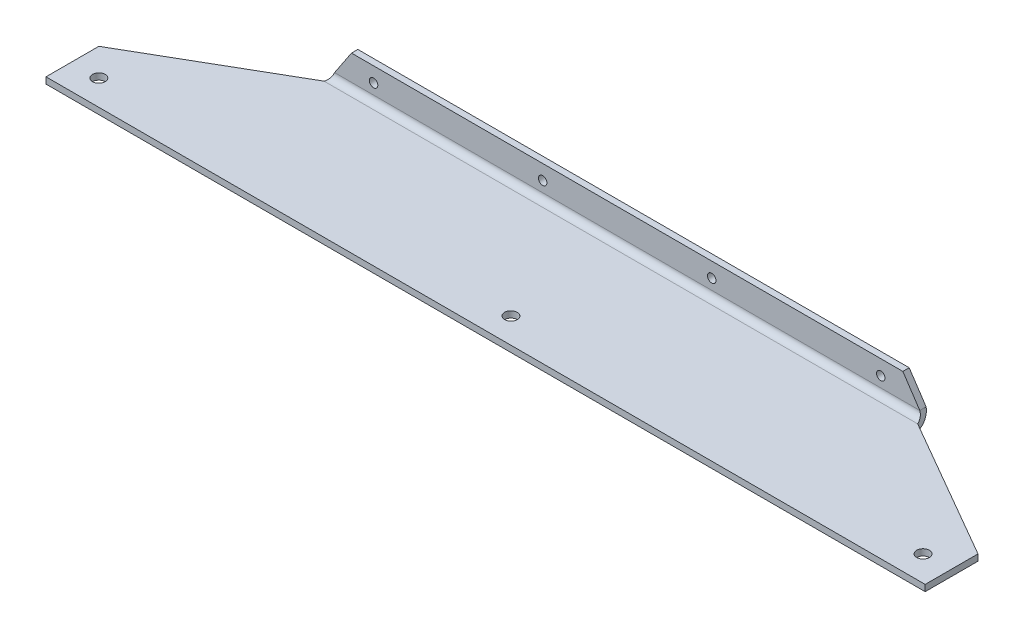
ISO-10303-21;
HEADER;
FILE_DESCRIPTION(('STEP AP214'),'2;1');
FILE_NAME('part.step','',(''),(''),'','','');
FILE_SCHEMA(('AUTOMOTIVE_DESIGN { 1 0 10303 214 1 1 1 1 }'));
ENDSEC;
DATA;
#1=APPLICATION_CONTEXT('core data for automotive mechanical design processes');
#2=APPLICATION_PROTOCOL_DEFINITION('international standard','automotive_design',2000,#1);
#3=PRODUCT_CONTEXT('',#1,'mechanical');
#4=PRODUCT('Part','Part','',(#3));
#5=PRODUCT_RELATED_PRODUCT_CATEGORY('part','',(#4));
#6=PRODUCT_DEFINITION_FORMATION('','',#4);
#7=PRODUCT_DEFINITION_CONTEXT('part definition',#1,'design');
#8=PRODUCT_DEFINITION('design','',#6,#7);
#9=PRODUCT_DEFINITION_SHAPE('','',#8);
#10=(LENGTH_UNIT() NAMED_UNIT(*) SI_UNIT(.MILLI.,.METRE.));
#11=(NAMED_UNIT(*) PLANE_ANGLE_UNIT() SI_UNIT($,.RADIAN.));
#12=(NAMED_UNIT(*) SI_UNIT($,.STERADIAN.) SOLID_ANGLE_UNIT());
#13=UNCERTAINTY_MEASURE_WITH_UNIT(LENGTH_MEASURE(1.E-05),#10,'distance_accuracy_value','');
#14=(GEOMETRIC_REPRESENTATION_CONTEXT(3) GLOBAL_UNCERTAINTY_ASSIGNED_CONTEXT((#13)) GLOBAL_UNIT_ASSIGNED_CONTEXT((#10,
#11,#12)) REPRESENTATION_CONTEXT('',''));
#15=CARTESIAN_POINT('',(0.,0.,0.));
#16=DIRECTION('',(0.,0.,1.));
#17=DIRECTION('',(1.,0.,0.));
#18=AXIS2_PLACEMENT_3D('',#15,#16,#17);
#19=CARTESIAN_POINT('',(208.,-3.,7.00000000000001));
#20=DIRECTION('',(1.,0.,0.));
#21=DIRECTION('',(0.,0.,-1.));
#22=AXIS2_PLACEMENT_3D('',#19,#20,#21);
#23=PLANE('',#22);
#24=DIRECTION('',(0.,0.,-1.));
#25=VECTOR('',#24,1.);
#26=CARTESIAN_POINT('',(208.,0.,7.00000000000001));
#27=LINE('',#26,#25);
#28=CARTESIAN_POINT('',(208.,0.,32.));
#29=VERTEX_POINT('',#28);
#30=CARTESIAN_POINT('',(208.,0.,7.00000000000001));
#31=VERTEX_POINT('',#30);
#32=EDGE_CURVE('E153',#29,#31,#27,.T.);
#33=ORIENTED_EDGE('',*,*,#32,.F.);
#34=DIRECTION('',(0.,1.,0.));
#35=VECTOR('',#34,1.);
#36=CARTESIAN_POINT('',(208.,-3.,32.));
#37=LINE('',#36,#35);
#38=CARTESIAN_POINT('',(208.,-3.,32.));
#39=VERTEX_POINT('',#38);
#40=EDGE_CURVE('E13',#39,#29,#37,.T.);
#41=ORIENTED_EDGE('',*,*,#40,.F.);
#42=DIRECTION('',(0.,0.,-1.));
#43=VECTOR('',#42,1.);
#44=CARTESIAN_POINT('',(208.,-3.,7.00000000000001));
#45=LINE('',#44,#43);
#46=CARTESIAN_POINT('',(208.,-3.,7.00000000000001));
#47=VERTEX_POINT('',#46);
#48=EDGE_CURVE('E168',#39,#47,#45,.T.);
#49=ORIENTED_EDGE('',*,*,#48,.T.);
#50=DIRECTION('',(0.,1.,0.));
#51=VECTOR('',#50,1.);
#52=CARTESIAN_POINT('',(208.,-3.,7.00000000000001));
#53=LINE('',#52,#51);
#54=EDGE_CURVE('E70',#47,#31,#53,.T.);
#55=ORIENTED_EDGE('',*,*,#54,.T.);
#56=EDGE_LOOP('',(#33,#41,#49,#55));
#57=FACE_BOUND('',#56,.T.);
#58=ADVANCED_FACE('F67',(#57),#23,.T.);
#59=CARTESIAN_POINT('',(-208.,-3.,32.));
#60=DIRECTION('',(0.,0.,1.));
#61=DIRECTION('',(1.,0.,0.));
#62=AXIS2_PLACEMENT_3D('',#59,#60,#61);
#63=PLANE('',#62);
#64=DIRECTION('',(1.,0.,0.));
#65=VECTOR('',#64,1.);
#66=CARTESIAN_POINT('',(-208.,0.,32.));
#67=LINE('',#66,#65);
#68=CARTESIAN_POINT('',(-208.,0.,32.));
#69=VERTEX_POINT('',#68);
#70=EDGE_CURVE('E166',#69,#29,#67,.T.);
#71=ORIENTED_EDGE('',*,*,#70,.F.);
#72=DIRECTION('',(0.,1.,0.));
#73=VECTOR('',#72,1.);
#74=CARTESIAN_POINT('',(-208.,-3.,32.));
#75=LINE('',#74,#73);
#76=CARTESIAN_POINT('',(-208.,-3.,32.));
#77=VERTEX_POINT('',#76);
#78=EDGE_CURVE('E76',#77,#69,#75,.T.);
#79=ORIENTED_EDGE('',*,*,#78,.F.);
#80=DIRECTION('',(1.,0.,0.));
#81=VECTOR('',#80,1.);
#82=CARTESIAN_POINT('',(-208.,-3.,32.));
#83=LINE('',#82,#81);
#84=EDGE_CURVE('E141',#77,#39,#83,.T.);
#85=ORIENTED_EDGE('',*,*,#84,.T.);
#86=ORIENTED_EDGE('',*,*,#40,.T.);
#87=EDGE_LOOP('',(#71,#79,#85,#86));
#88=FACE_BOUND('',#87,.T.);
#89=ADVANCED_FACE('F177',(#88),#63,.T.);
#90=CARTESIAN_POINT('',(-208.,-3.,7.));
#91=DIRECTION('',(-1.,0.,0.));
#92=DIRECTION('',(0.,0.,1.));
#93=AXIS2_PLACEMENT_3D('',#90,#91,#92);
#94=PLANE('',#93);
#95=DIRECTION('',(0.,0.,1.));
#96=VECTOR('',#95,1.);
#97=CARTESIAN_POINT('',(-208.,0.,7.));
#98=LINE('',#97,#96);
#99=CARTESIAN_POINT('',(-208.,0.,7.));
#100=VERTEX_POINT('',#99);
#101=EDGE_CURVE('E130',#100,#69,#98,.T.);
#102=ORIENTED_EDGE('',*,*,#101,.F.);
#103=DIRECTION('',(0.,1.,0.));
#104=VECTOR('',#103,1.);
#105=CARTESIAN_POINT('',(-208.,-3.,7.));
#106=LINE('',#105,#104);
#107=CARTESIAN_POINT('',(-208.,-3.,7.));
#108=VERTEX_POINT('',#107);
#109=EDGE_CURVE('E125',#108,#100,#106,.T.);
#110=ORIENTED_EDGE('',*,*,#109,.F.);
#111=DIRECTION('',(0.,0.,1.));
#112=VECTOR('',#111,1.);
#113=CARTESIAN_POINT('',(-208.,-3.,7.));
#114=LINE('',#113,#112);
#115=EDGE_CURVE('E128',#108,#77,#114,.T.);
#116=ORIENTED_EDGE('',*,*,#115,.T.);
#117=ORIENTED_EDGE('',*,*,#78,.T.);
#118=EDGE_LOOP('',(#102,#110,#116,#117));
#119=FACE_BOUND('',#118,.T.);
#120=ADVANCED_FACE('F127',(#119),#94,.T.);
#121=CARTESIAN_POINT('',(-208.,-3.,7.));
#122=DIRECTION('',(-0.500000000000004,0.,-0.866025403784436));
#123=DIRECTION('',(-0.866025403784436,0.,0.500000000000004));
#124=AXIS2_PLACEMENT_3D('',#121,#122,#123);
#125=PLANE('',#124);
#126=DIRECTION('',(-0.866025403784436,0.,0.500000000000004));
#127=VECTOR('',#126,1.);
#128=CARTESIAN_POINT('',(-208.,0.,7.));
#129=LINE('',#128,#127);
#130=CARTESIAN_POINT('',(-140.450018504815,0.,-32.));
#131=VERTEX_POINT('',#130);
#132=EDGE_CURVE('E163',#131,#100,#129,.T.);
#133=ORIENTED_EDGE('',*,*,#132,.F.);
#134=DIRECTION('',(0.,1.,0.));
#135=VECTOR('',#134,1.);
#136=CARTESIAN_POINT('',(-140.450018504815,-3.,-32.));
#137=LINE('',#136,#135);
#138=CARTESIAN_POINT('',(-140.450018504815,-3.00000000000003,-32.));
#139=VERTEX_POINT('',#138);
#140=EDGE_CURVE('E134',#139,#131,#137,.T.);
#141=ORIENTED_EDGE('',*,*,#140,.F.);
#142=DIRECTION('',(-0.866025403784436,0.,0.500000000000004));
#143=VECTOR('',#142,1.);
#144=CARTESIAN_POINT('',(-208.,-3.,7.));
#145=LINE('',#144,#143);
#146=EDGE_CURVE('E139',#139,#108,#145,.T.);
#147=ORIENTED_EDGE('',*,*,#146,.T.);
#148=ORIENTED_EDGE('',*,*,#109,.T.);
#149=EDGE_LOOP('',(#133,#141,#147,#148));
#150=FACE_BOUND('',#149,.T.);
#151=ADVANCED_FACE('F143',(#150),#125,.T.);
#152=CARTESIAN_POINT('',(140.450018504813,-3.,-32.));
#153=DIRECTION('',(0.499999999999998,0.,-0.86602540378444));
#154=DIRECTION('',(-0.86602540378444,0.,-0.499999999999998));
#155=AXIS2_PLACEMENT_3D('',#152,#153,#154);
#156=PLANE('',#155);
#157=DIRECTION('',(-0.86602540378444,0.,-0.499999999999998));
#158=VECTOR('',#157,1.);
#159=CARTESIAN_POINT('',(140.450018504813,0.,-32.));
#160=LINE('',#159,#158);
#161=CARTESIAN_POINT('',(140.450018504813,0.,-32.));
#162=VERTEX_POINT('',#161);
#163=EDGE_CURVE('E156',#31,#162,#160,.T.);
#164=ORIENTED_EDGE('',*,*,#163,.F.);
#165=ORIENTED_EDGE('',*,*,#54,.F.);
#166=DIRECTION('',(-0.86602540378444,0.,-0.499999999999998));
#167=VECTOR('',#166,1.);
#168=CARTESIAN_POINT('',(140.450018504813,-3.,-32.));
#169=LINE('',#168,#167);
#170=CARTESIAN_POINT('',(140.450018504813,-3.,-32.));
#171=VERTEX_POINT('',#170);
#172=EDGE_CURVE('E148',#47,#171,#169,.T.);
#173=ORIENTED_EDGE('',*,*,#172,.T.);
#174=DIRECTION('',(0.,1.,0.));
#175=VECTOR('',#174,1.);
#176=CARTESIAN_POINT('',(140.450018504813,-3.,-32.));
#177=LINE('',#176,#175);
#178=EDGE_CURVE('E171',#171,#162,#177,.T.);
#179=ORIENTED_EDGE('',*,*,#178,.T.);
#180=EDGE_LOOP('',(#164,#165,#173,#179));
#181=FACE_BOUND('',#180,.T.);
#182=ADVANCED_FACE('F173',(#181),#156,.T.);
#183=CARTESIAN_POINT('',(0.,-3.,0.));
#184=DIRECTION('',(0.,1.,0.));
#185=DIRECTION('',(0.,0.,1.));
#186=AXIS2_PLACEMENT_3D('',#183,#184,#185);
#187=PLANE('',#186);
#188=CARTESIAN_POINT('',(0.,-3.,20.));
#189=DIRECTION('',(0.,1.,0.));
#190=DIRECTION('',(0.,0.,1.));
#191=AXIS2_PLACEMENT_3D('',#188,#189,#190);
#192=CIRCLE('',#191,3.);
#193=CARTESIAN_POINT('',(0.,-3.,23.));
#194=VERTEX_POINT('',#193);
#195=EDGE_CURVE('E255',#194,#194,#192,.T.);
#196=ORIENTED_EDGE('',*,*,#195,.T.);
#197=EDGE_LOOP('',(#196));
#198=FACE_BOUND('',#197,.T.);
#199=CARTESIAN_POINT('',(195.,-3.,20.));
#200=DIRECTION('',(0.,1.,0.));
#201=DIRECTION('',(0.,0.,1.));
#202=AXIS2_PLACEMENT_3D('',#199,#200,#201);
#203=CIRCLE('',#202,2.99999999999999);
#204=CARTESIAN_POINT('',(195.,-3.,23.));
#205=VERTEX_POINT('',#204);
#206=EDGE_CURVE('E382',#205,#205,#203,.T.);
#207=ORIENTED_EDGE('',*,*,#206,.T.);
#208=EDGE_LOOP('',(#207));
#209=FACE_BOUND('',#208,.T.);
#210=CARTESIAN_POINT('',(-195.,-3.,20.));
#211=DIRECTION('',(0.,1.,0.));
#212=DIRECTION('',(0.,0.,1.));
#213=AXIS2_PLACEMENT_3D('',#210,#211,#212);
#214=CIRCLE('',#213,2.99999999999999);
#215=CARTESIAN_POINT('',(-195.,-3.,23.));
#216=VERTEX_POINT('',#215);
#217=EDGE_CURVE('E157',#216,#216,#214,.T.);
#218=ORIENTED_EDGE('',*,*,#217,.T.);
#219=EDGE_LOOP('',(#218));
#220=FACE_BOUND('',#219,.T.);
#221=ORIENTED_EDGE('',*,*,#48,.F.);
#222=ORIENTED_EDGE('',*,*,#84,.F.);
#223=ORIENTED_EDGE('',*,*,#115,.F.);
#224=ORIENTED_EDGE('',*,*,#146,.F.);
#225=DIRECTION('',(-1.,0.,0.));
#226=VECTOR('',#225,1.);
#227=CARTESIAN_POINT('',(-140.450018504815,-3.,-32.));
#228=LINE('',#227,#226);
#229=EDGE_CURVE('E146',#171,#139,#228,.T.);
#230=ORIENTED_EDGE('',*,*,#229,.F.);
#231=ORIENTED_EDGE('',*,*,#172,.F.);
#232=EDGE_LOOP('',(#221,#222,#223,#224,#230,#231));
#233=FACE_BOUND('',#232,.T.);
#234=ADVANCED_FACE('F138',(#198,#209,#220,#233),#187,.F.);
#235=CARTESIAN_POINT('',(0.,0.,0.));
#236=DIRECTION('',(0.,1.,0.));
#237=DIRECTION('',(0.,0.,1.));
#238=AXIS2_PLACEMENT_3D('',#235,#236,#237);
#239=PLANE('',#238);
#240=CARTESIAN_POINT('',(0.,0.,20.));
#241=DIRECTION('',(0.,1.,0.));
#242=DIRECTION('',(0.,0.,1.));
#243=AXIS2_PLACEMENT_3D('',#240,#241,#242);
#244=CIRCLE('',#243,3.);
#245=CARTESIAN_POINT('',(0.,0.,23.));
#246=VERTEX_POINT('',#245);
#247=EDGE_CURVE('E277',#246,#246,#244,.T.);
#248=ORIENTED_EDGE('',*,*,#247,.F.);
#249=EDGE_LOOP('',(#248));
#250=FACE_BOUND('',#249,.T.);
#251=CARTESIAN_POINT('',(195.,0.,20.));
#252=DIRECTION('',(0.,1.,0.));
#253=DIRECTION('',(0.,0.,1.));
#254=AXIS2_PLACEMENT_3D('',#251,#252,#253);
#255=CIRCLE('',#254,2.99999999999999);
#256=CARTESIAN_POINT('',(195.,0.,23.));
#257=VERTEX_POINT('',#256);
#258=EDGE_CURVE('E385',#257,#257,#255,.T.);
#259=ORIENTED_EDGE('',*,*,#258,.F.);
#260=EDGE_LOOP('',(#259));
#261=FACE_BOUND('',#260,.T.);
#262=CARTESIAN_POINT('',(-195.,0.,20.));
#263=DIRECTION('',(0.,1.,0.));
#264=DIRECTION('',(0.,0.,1.));
#265=AXIS2_PLACEMENT_3D('',#262,#263,#264);
#266=CIRCLE('',#265,2.99999999999999);
#267=CARTESIAN_POINT('',(-195.,0.,23.));
#268=VERTEX_POINT('',#267);
#269=EDGE_CURVE('E379',#268,#268,#266,.T.);
#270=ORIENTED_EDGE('',*,*,#269,.F.);
#271=EDGE_LOOP('',(#270));
#272=FACE_BOUND('',#271,.T.);
#273=ORIENTED_EDGE('',*,*,#32,.T.);
#274=ORIENTED_EDGE('',*,*,#163,.T.);
#275=DIRECTION('',(-1.,0.,0.));
#276=VECTOR('',#275,1.);
#277=CARTESIAN_POINT('',(-140.450018504815,0.,-32.));
#278=LINE('',#277,#276);
#279=EDGE_CURVE('E160',#162,#131,#278,.T.);
#280=ORIENTED_EDGE('',*,*,#279,.T.);
#281=ORIENTED_EDGE('',*,*,#132,.T.);
#282=ORIENTED_EDGE('',*,*,#101,.T.);
#283=ORIENTED_EDGE('',*,*,#70,.T.);
#284=EDGE_LOOP('',(#273,#274,#280,#281,#282,#283));
#285=FACE_BOUND('',#284,.T.);
#286=ADVANCED_FACE('F176',(#250,#261,#272,#285),#239,.T.);
#287=CARTESIAN_POINT('',(-195.,-3.,20.));
#288=DIRECTION('',(0.,1.,0.));
#289=DIRECTION('',(0.,0.,1.));
#290=AXIS2_PLACEMENT_3D('',#287,#288,#289);
#291=CYLINDRICAL_SURFACE('',#290,2.99999999999999);
#292=ORIENTED_EDGE('',*,*,#217,.F.);
#293=EDGE_LOOP('',(#292));
#294=FACE_BOUND('',#293,.T.);
#295=ORIENTED_EDGE('',*,*,#269,.T.);
#296=EDGE_LOOP('',(#295));
#297=FACE_BOUND('',#296,.T.);
#298=ADVANCED_FACE('F197',(#294,#297),#291,.F.);
#299=CARTESIAN_POINT('',(195.,-3.,20.));
#300=DIRECTION('',(0.,1.,0.));
#301=DIRECTION('',(0.,0.,1.));
#302=AXIS2_PLACEMENT_3D('',#299,#300,#301);
#303=CYLINDRICAL_SURFACE('',#302,2.99999999999999);
#304=ORIENTED_EDGE('',*,*,#206,.F.);
#305=EDGE_LOOP('',(#304));
#306=FACE_BOUND('',#305,.T.);
#307=ORIENTED_EDGE('',*,*,#258,.T.);
#308=EDGE_LOOP('',(#307));
#309=FACE_BOUND('',#308,.T.);
#310=ADVANCED_FACE('F204',(#306,#309),#303,.F.);
#311=CARTESIAN_POINT('',(0.,-3.,20.));
#312=DIRECTION('',(0.,1.,0.));
#313=DIRECTION('',(0.,0.,1.));
#314=AXIS2_PLACEMENT_3D('',#311,#312,#313);
#315=CYLINDRICAL_SURFACE('',#314,3.);
#316=ORIENTED_EDGE('',*,*,#195,.F.);
#317=EDGE_LOOP('',(#316));
#318=FACE_BOUND('',#317,.T.);
#319=ORIENTED_EDGE('',*,*,#247,.T.);
#320=EDGE_LOOP('',(#319));
#321=FACE_BOUND('',#320,.T.);
#322=ADVANCED_FACE('F208',(#318,#321),#315,.F.);
#323=CARTESIAN_POINT('',(140.450018504813,-3.03000000000003,-32.));
#324=CARTESIAN_POINT('',(140.283323050554,-3.03000000000003,-32.7894614125076));
#325=CARTESIAN_POINT('',(140.11668517148,-2.87305524030997,-33.5783397426865));
#326=CARTESIAN_POINT('',(139.783351838147,-2.2689319217762,-35.0368224516365));
#327=CARTESIAN_POINT('',(139.61668517148,-1.82199105966105,-35.7057167214488));
#328=CARTESIAN_POINT('',(139.283351838147,-0.705716721448752,-36.821991059661));
#329=CARTESIAN_POINT('',(139.11668517148,-0.0368224516365325,-37.2689319217762));
#330=CARTESIAN_POINT('',(138.783351838147,1.42166025731354,-37.87305524031));
#331=CARTESIAN_POINT('',(138.616713959073,2.21053858749238,-38.03));
#332=CARTESIAN_POINT('',(138.450018504814,3.00000000000001,-38.03));
#333=CARTESIAN_POINT('',(140.450018504813,-3.00000000000003,-32.));
#334=CARTESIAN_POINT('',(140.283323083471,-3.00000000000003,-32.7855336666159));
#335=CARTESIAN_POINT('',(140.11668517148,-2.84383606000992,-33.5704873061557));
#336=CARTESIAN_POINT('',(139.783351838147,-2.24271833012557,-35.0217138822254));
#337=CARTESIAN_POINT('',(139.61668517148,-1.7980010543891,-35.6872803198495));
#338=CARTESIAN_POINT('',(139.283351838147,-0.687280319849504,-36.7980010543891));
#339=CARTESIAN_POINT('',(139.11668517148,-0.0217138822254056,-37.2427183301256));
#340=CARTESIAN_POINT('',(138.783351838147,1.42951269384432,-37.8438360600099));
#341=CARTESIAN_POINT('',(138.616713926156,2.21446633338407,-38.));
#342=CARTESIAN_POINT('',(138.450018504814,3.00000000000001,-38.));
#343=CARTESIAN_POINT('',(140.450018504813,0.,-32.));
#344=CARTESIAN_POINT('',(140.28332637516,0.,-32.3927590774468));
#345=CARTESIAN_POINT('',(140.11668517148,0.0780819699950224,-32.7852436530778));
#346=CARTESIAN_POINT('',(139.783351838147,0.378640834937198,-33.5108569411127));
#347=CARTESIAN_POINT('',(139.61668517148,0.600999472805433,-33.8436401599247));
#348=CARTESIAN_POINT('',(139.283351838147,1.15635984007523,-34.3990005271946));
#349=CARTESIAN_POINT('',(139.11668517148,1.48914305888728,-34.6213591650628));
#350=CARTESIAN_POINT('',(138.783351838147,2.21475634692214,-34.921918030005));
#351=CARTESIAN_POINT('',(138.616710634467,2.60724092255315,-35.));
#352=CARTESIAN_POINT('',(138.450018504814,2.99999999999999,-35.));
#353=CARTESIAN_POINT('',(140.450018504813,0.0302999999999683,-32.));
#354=CARTESIAN_POINT('',(140.283326408406,0.0302999999999683,-32.3887920540962));
#355=CARTESIAN_POINT('',(140.11668517148,0.107593342098072,-32.7773126921818));
#356=CARTESIAN_POINT('',(139.783351838147,0.405116562504332,-33.4955972860075));
#357=CARTESIAN_POINT('',(139.61668517148,0.625229378130098,-33.8250193943095));
#358=CARTESIAN_POINT('',(139.283351838147,1.17498060569047,-34.3747706218699));
#359=CARTESIAN_POINT('',(139.11668517148,1.50440271399252,-34.5948834374957));
#360=CARTESIAN_POINT('',(138.783351838147,2.22268730781823,-34.8924066579019));
#361=CARTESIAN_POINT('',(138.616710601221,2.61120794590376,-34.9697));
#362=CARTESIAN_POINT('',(138.450018504814,2.99999999999999,-34.9697));
#363=B_SPLINE_SURFACE_WITH_KNOTS('',1,3,((#323,#324,#325,#326,#327,#328,#329,#330,#331,#332),
(#333,#334,#335,#336,#337,#338,#339,#340,#341,#342),(#343,#344,#345,#346,#347,#348,#349,#350,
#351,#352),(#353,#354,#355,#356,#357,#358,#359,#360,#361,#362)),.UNSPECIFIED.,.F.,.F.,.F.,(2,1,
1,2),(4,2,2,2,4),(-0.01,0.,1.,1.0101),(0.,0.25,0.5,0.75,1.),.UNSPECIFIED.);
#364=DIRECTION('',(0.,0.,1.));
#365=VECTOR('',#364,1.);
#366=CARTESIAN_POINT('',(138.450018504814,3.00000000000001,-38.));
#367=LINE('',#366,#365);
#368=CARTESIAN_POINT('',(138.450018504814,2.99999999999996,-35.));
#369=VERTEX_POINT('',#368);
#370=CARTESIAN_POINT('',(138.450018504814,2.99999999999995,-38.));
#371=VERTEX_POINT('',#370);
#372=EDGE_CURVE('E278',#369,#371,#367,.F.);
#373=CARTESIAN_POINT('',(140.450018504813,0.,-32.));
#374=CARTESIAN_POINT('',(140.411073482294,-1.14746487447527E-05,-32.0917574482137));
#375=CARTESIAN_POINT('',(140.372130834144,0.00420961446601031,-32.1835107056047));
#376=CARTESIAN_POINT('',(140.294249405129,0.0210291252750724,-32.3662418613946));
#377=CARTESIAN_POINT('',(140.255310624168,0.0336270712064461,-32.4572198035303));
#378=CARTESIAN_POINT('',(140.177463184837,0.0670989497195397,-32.637570831802));
#379=CARTESIAN_POINT('',(140.138554527631,0.0879661665554421,-32.7269451588713));
#380=CARTESIAN_POINT('',(140.060745082901,0.137778506635897,-32.9033846913295));
#381=CARTESIAN_POINT('',(140.021844295271,0.16672351353557,-32.9904499299565));
#382=CARTESIAN_POINT('',(139.905106565489,0.265395402850399,-33.247188050226));
#383=CARTESIAN_POINT('',(139.827210286558,0.346969700663915,-33.4124597838399));
#384=CARTESIAN_POINT('',(139.671489481402,0.538830763683246,-33.7252086308306));
#385=CARTESIAN_POINT('',(139.593664940562,0.649108792834731,-33.8726911384524));
#386=CARTESIAN_POINT('',(139.438033928047,0.894664450217295,-34.1450250198499));
#387=CARTESIAN_POINT('',(139.360227467522,1.02992924919392,-34.2698879425976));
#388=CARTESIAN_POINT('',(139.204597748106,1.32100246928967,-34.4929159286549));
#389=CARTESIAN_POINT('',(139.126774501727,1.47682160205879,-34.5910669891305));
#390=CARTESIAN_POINT('',(138.971027072382,1.80394210113431,-34.7573677267359));
#391=CARTESIAN_POINT('',(138.893102856984,1.97525249963729,-34.8254997635332));
#392=CARTESIAN_POINT('',(138.776369472314,2.2390538164158,-34.9033428322858));
#393=CARTESIAN_POINT('',(138.73749455978,2.32810131393956,-34.9252286698487));
#394=CARTESIAN_POINT('',(138.659749559621,2.50781276634277,-34.9607635142073));
#395=CARTESIAN_POINT('',(138.620879479789,2.59847586669423,-34.9744167496392));
#396=CARTESIAN_POINT('',(138.559999263378,2.74115019601546,-34.9892628754749));
#397=CARTESIAN_POINT('',(138.537983541784,2.79288260610807,-34.9932915285957));
#398=CARTESIAN_POINT('',(138.493985613547,2.89640765353057,-34.9986580261783));
#399=CARTESIAN_POINT('',(138.472003407008,2.9482000786205,-34.9999999657767));
#400=CARTESIAN_POINT('',(138.450018504814,2.99999999999999,-35.));
#401=B_SPLINE_CURVE_WITH_KNOTS('',3,(#373,#374,#375,#376,#377,#378,#379,#380,#381,#382,#383,
#384,#385,#386,#387,#388,#389,#390,#391,#392,#393,#394,#395,#396,#397,#398,#399,#400),
.UNSPECIFIED.,.F.,.F.,(4,2,2,2,2,2,2,2,2,2,2,2,2,4),(0.,0.298942773772956,0.59786857056428,
0.89655209581894,1.19523131933944,1.79240544490549,2.38939803108471,2.98608494396096,
3.58308405085973,4.18043351100953,4.47894323910198,4.77729950821914,4.9463423004865,
5.11512723796627),.UNSPECIFIED.);
#402=EDGE_CURVE('E249',#162,#369,#401,.T.);
#403=CARTESIAN_POINT('',(140.450018504813,-3.00000000000003,-32.));
#404=CARTESIAN_POINT('',(140.413405467954,-3.00001980996354,-32.1725278872341));
#405=CARTESIAN_POINT('',(140.376793080065,-2.99255936512537,-32.3450530100036));
#406=CARTESIAN_POINT('',(140.303571725544,-2.96282101520334,-32.6888135036975));
#407=CARTESIAN_POINT('',(140.266962758834,-2.94054385463691,-32.8600489389896));
#408=CARTESIAN_POINT('',(140.193774910289,-2.88133792443619,-33.1998324155716));
#409=CARTESIAN_POINT('',(140.157196027016,-2.84442046234174,-33.3683824267076));
#410=CARTESIAN_POINT('',(140.084035382072,-2.75621489061939,-33.7016761081979));
#411=CARTESIAN_POINT('',(140.047453620443,-2.70492696295825,-33.866419826721));
#412=CARTESIAN_POINT('',(139.974275740501,-2.58833599277368,-34.1909453057617));
#413=CARTESIAN_POINT('',(139.937679622279,-2.52302737165752,-34.3507250621526));
#414=CARTESIAN_POINT('',(139.864473309763,-2.37886629551757,-34.6641243347353));
#415=CARTESIAN_POINT('',(139.82786311525,-2.30000886161689,-34.8177415606505));
#416=CARTESIAN_POINT('',(139.754660881447,-2.12938672265717,-35.117551839979));
#417=CARTESIAN_POINT('',(139.718068840753,-2.03762719379737,-35.2637478388618));
#418=CARTESIAN_POINT('',(139.644882930668,-1.84185718278167,-35.5476975622954));
#419=CARTESIAN_POINT('',(139.608289061255,-1.73784644183416,-35.6854511084166));
#420=CARTESIAN_POINT('',(139.535100254086,-1.51835347269846,-35.9514830370543));
#421=CARTESIAN_POINT('',(139.498505316445,-1.40287174353012,-36.0797618313259));
#422=CARTESIAN_POINT('',(139.425315910063,-1.16129057002383,-36.3258983965862));
#423=CARTESIAN_POINT('',(139.388721441322,-1.03519112302524,-36.4437561649635));
#424=CARTESIAN_POINT('',(139.315523429178,-0.773274257629088,-36.6682067630497));
#425=CARTESIAN_POINT('',(139.278919886124,-0.637454110233098,-36.7747964083666));
#426=CARTESIAN_POINT('',(139.205715902872,-0.357139717193705,-36.9758782959468));
#427=CARTESIAN_POINT('',(139.169115462624,-0.212645652910675,-37.0703707910166));
#428=CARTESIAN_POINT('',(139.095893732441,0.0840156086725997,-37.2466003627467));
#429=CARTESIAN_POINT('',(139.059272440942,0.236186461702365,-37.3283312849463));
#430=CARTESIAN_POINT('',(138.986043280869,0.54694803566774,-37.4783478687481));
#431=CARTESIAN_POINT('',(138.949435412298,0.705536382333398,-37.5466384490036));
#432=CARTESIAN_POINT('',(138.876237309241,1.02792594476599,-37.6692724055005));
#433=CARTESIAN_POINT('',(138.839647075222,1.1917244780204,-37.7236228323803));
#434=CARTESIAN_POINT('',(138.76648252245,1.52333680430503,-37.8180051991504));
#435=CARTESIAN_POINT('',(138.729908202299,1.6911493255245,-37.8580416118892));
#436=CARTESIAN_POINT('',(138.652748505039,2.04815264346776,-37.9271013363047));
#437=CARTESIAN_POINT('',(138.612162582135,2.23767174863167,-37.9544380253608));
#438=CARTESIAN_POINT('',(138.531056974058,2.61813126562151,-37.9908879647538));
#439=CARTESIAN_POINT('',(138.490537292259,2.80906875175976,-38.0000317796838));
#440=CARTESIAN_POINT('',(138.450018504814,3.00000000000001,-38.));
#441=B_SPLINE_CURVE_WITH_KNOTS('',3,(#403,#404,#405,#406,#407,#408,#409,#410,#411,#412,#413,
#414,#415,#416,#417,#418,#419,#420,#421,#422,#423,#424,#425,#426,#427,#428,#429,#430,#431,#432,
#433,#434,#435,#436,#437,#438,#439,#440),.UNSPECIFIED.,.F.,.F.,(4,2,2,2,2,2,2,2,2,2,2,2,2,2,2,2,
2,2,4),(0.,0.528948364281429,1.05787015172027,1.58638421584879,2.11489158794275,
2.64360963505201,3.17252239106145,3.70122355450117,4.22993588809874,4.75862523130523,
5.28731470699374,5.8161531941101,6.34498062774711,6.87406231386957,7.40295001472576,
7.93156968536892,8.46002402806486,9.04636125675835,9.63171258611531),.UNSPECIFIED.);
#442=EDGE_CURVE('E270',#171,#371,#441,.T.);
#443=ORIENTED_EDGE('',*,*,#372,.F.);
#444=ORIENTED_EDGE('',*,*,#402,.F.);
#445=ORIENTED_EDGE('',*,*,#178,.F.);
#446=ORIENTED_EDGE('',*,*,#442,.T.);
#447=EDGE_LOOP('',(#443,#444,#445,#446));
#448=FACE_BOUND('',#447,.T.);
#449=ADVANCED_FACE('F212',(#448),#363,.F.);
#450=CARTESIAN_POINT('',(-138.450018504815,3.00000000000001,-38.03));
#451=CARTESIAN_POINT('',(-138.616713959074,2.21053858749239,-38.03));
#452=CARTESIAN_POINT('',(-138.783351838148,1.42166025731354,-37.87305524031));
#453=CARTESIAN_POINT('',(-139.116685171481,-0.0368224516365292,-37.2689319217762));
#454=CARTESIAN_POINT('',(-139.283351838148,-0.70571672144875,-36.821991059661));
#455=CARTESIAN_POINT('',(-139.616685171481,-1.82199105966105,-35.7057167214488));
#456=CARTESIAN_POINT('',(-139.783351838148,-2.2689319217762,-35.0368224516365));
#457=CARTESIAN_POINT('',(-140.116685171481,-2.87305524030997,-33.5783397426865));
#458=CARTESIAN_POINT('',(-140.283323050555,-3.03000000000003,-32.7894614125076));
#459=CARTESIAN_POINT('',(-140.450018504815,-3.03000000000003,-32.));
#460=CARTESIAN_POINT('',(-138.450018504815,3.00000000000001,-38.));
#461=CARTESIAN_POINT('',(-138.616713926157,2.21446633338408,-38.));
#462=CARTESIAN_POINT('',(-138.783351838148,1.42951269384432,-37.8438360600099));
#463=CARTESIAN_POINT('',(-139.116685171481,-0.0217138822254024,-37.2427183301256));
#464=CARTESIAN_POINT('',(-139.283351838148,-0.687280319849503,-36.7980010543891));
#465=CARTESIAN_POINT('',(-139.616685171481,-1.7980010543891,-35.6872803198495));
#466=CARTESIAN_POINT('',(-139.783351838148,-2.24271833012557,-35.0217138822254));
#467=CARTESIAN_POINT('',(-140.116685171481,-2.84383606000992,-33.5704873061557));
#468=CARTESIAN_POINT('',(-140.283323083472,-3.00000000000003,-32.7855336666159));
#469=CARTESIAN_POINT('',(-140.450018504815,-3.00000000000003,-32.));
#470=CARTESIAN_POINT('',(-138.450018504815,2.99999999999999,-35.));
#471=CARTESIAN_POINT('',(-138.616710634468,2.60724092255319,-35.));
#472=CARTESIAN_POINT('',(-138.783351838148,2.21475634692215,-34.921918030005));
#473=CARTESIAN_POINT('',(-139.116685171481,1.48914305888728,-34.6213591650628));
#474=CARTESIAN_POINT('',(-139.283351838148,1.15635984007523,-34.3990005271946));
#475=CARTESIAN_POINT('',(-139.616685171481,0.600999472805434,-33.8436401599247));
#476=CARTESIAN_POINT('',(-139.783351838148,0.378640834937198,-33.5108569411127));
#477=CARTESIAN_POINT('',(-140.116685171481,0.0780819699950222,-32.7852436530778));
#478=CARTESIAN_POINT('',(-140.283326375162,0.,-32.3927590774468));
#479=CARTESIAN_POINT('',(-140.450018504815,0.,-32.));
#480=CARTESIAN_POINT('',(-138.450018504815,2.99999999999999,-34.9697));
#481=CARTESIAN_POINT('',(-138.616710601221,2.6112079459038,-34.9697));
#482=CARTESIAN_POINT('',(-138.783351838148,2.22268730781823,-34.8924066579019));
#483=CARTESIAN_POINT('',(-139.116685171481,1.50440271399252,-34.5948834374957));
#484=CARTESIAN_POINT('',(-139.283351838148,1.17498060569047,-34.3747706218699));
#485=CARTESIAN_POINT('',(-139.616685171481,0.625229378130098,-33.8250193943095));
#486=CARTESIAN_POINT('',(-139.783351838148,0.405116562504332,-33.4955972860075));
#487=CARTESIAN_POINT('',(-140.116685171481,0.107593342098072,-32.7773126921818));
#488=CARTESIAN_POINT('',(-140.283326408408,0.0302999999999683,-32.3887920540962));
#489=CARTESIAN_POINT('',(-140.450018504815,0.0302999999999683,-32.));
#490=B_SPLINE_SURFACE_WITH_KNOTS('',1,3,((#450,#451,#452,#453,#454,#455,#456,#457,#458,#459),
(#460,#461,#462,#463,#464,#465,#466,#467,#468,#469),(#470,#471,#472,#473,#474,#475,#476,#477,
#478,#479),(#480,#481,#482,#483,#484,#485,#486,#487,#488,#489)),.UNSPECIFIED.,.F.,.F.,.F.,(2,1,
1,2),(4,2,2,2,4),(-0.01,0.,1.,1.0101),(0.,0.25,0.5,0.75,1.),.UNSPECIFIED.);
#491=CARTESIAN_POINT('',(-138.450018504815,2.99999999999999,-35.));
#492=CARTESIAN_POINT('',(-138.488963527334,2.90824255178633,-35.0000114746487));
#493=CARTESIAN_POINT('',(-138.527906175484,2.81648929439533,-34.995790385534));
#494=CARTESIAN_POINT('',(-138.605787604499,2.63375813860538,-34.9789708747249));
#495=CARTESIAN_POINT('',(-138.64472638546,2.54278019646964,-34.9663729287935));
#496=CARTESIAN_POINT('',(-138.722573824791,2.36242916819793,-34.9329010502804));
#497=CARTESIAN_POINT('',(-138.761482481997,2.27305484112863,-34.9120338334445));
#498=CARTESIAN_POINT('',(-138.839291926727,2.09661530867049,-34.8622214933641));
#499=CARTESIAN_POINT('',(-138.878192714357,2.00955007004348,-34.8332764864644));
#500=CARTESIAN_POINT('',(-138.994930444139,1.75281194977395,-34.7346045971496));
#501=CARTESIAN_POINT('',(-139.07282672307,1.58754021616003,-34.653030299336));
#502=CARTESIAN_POINT('',(-139.228547528226,1.27479136916929,-34.4611692363167));
#503=CARTESIAN_POINT('',(-139.306372069066,1.12730886154753,-34.3508912071652));
#504=CARTESIAN_POINT('',(-139.462003081581,0.854974980150096,-34.1053355497826));
#505=CARTESIAN_POINT('',(-139.539809542107,0.730112057402305,-33.970070750806));
#506=CARTESIAN_POINT('',(-139.695439261522,0.507084071345025,-33.6789975307103));
#507=CARTESIAN_POINT('',(-139.773262507901,0.408933010869408,-33.5231783979411));
#508=CARTESIAN_POINT('',(-139.929009937246,0.242632273264009,-33.1960578988656));
#509=CARTESIAN_POINT('',(-140.006934152644,0.174500236466759,-33.0247475003626));
#510=CARTESIAN_POINT('',(-140.123667537314,0.096657167714207,-32.7609461835841));
#511=CARTESIAN_POINT('',(-140.162542449848,0.0747713301513027,-32.6718986860603));
#512=CARTESIAN_POINT('',(-140.240287450007,0.0392364857926332,-32.4921872336571));
#513=CARTESIAN_POINT('',(-140.279157529839,0.0255832503607456,-32.4015241333057));
#514=CARTESIAN_POINT('',(-140.34003774625,0.0107371245250871,-32.2588498039845));
#515=CARTESIAN_POINT('',(-140.362053467845,0.00670847140424741,-32.2071173938919));
#516=CARTESIAN_POINT('',(-140.406051396081,0.00134197382162563,-32.1035923464694));
#517=CARTESIAN_POINT('',(-140.42803360262,3.4223292549021E-08,-32.0517999213795));
#518=CARTESIAN_POINT('',(-140.450018504815,0.,-32.));
#519=B_SPLINE_CURVE_WITH_KNOTS('',3,(#491,#492,#493,#494,#495,#496,#497,#498,#499,#500,#501,
#502,#503,#504,#505,#506,#507,#508,#509,#510,#511,#512,#513,#514,#515,#516,#517,#518),
.UNSPECIFIED.,.F.,.F.,(4,2,2,2,2,2,2,2,2,2,2,2,2,4),(0.,0.298942773772963,0.597868570564315,
0.896552095819004,1.1952313193395,1.79240544490559,2.38939803108485,2.98608494396113,
3.58308405085995,4.18043351100973,4.47894323910218,4.77729950821933,4.94634230048667,
5.11512723796641),.UNSPECIFIED.);
#520=CARTESIAN_POINT('',(-138.450018504815,2.99999999999996,-35.));
#521=VERTEX_POINT('',#520);
#522=EDGE_CURVE('E242',#521,#131,#519,.T.);
#523=DIRECTION('',(0.,0.,1.));
#524=VECTOR('',#523,1.);
#525=CARTESIAN_POINT('',(-138.450018504815,3.,-35.0000000000019));
#526=LINE('',#525,#524);
#527=CARTESIAN_POINT('',(-138.450018504815,3.00000000000001,-38.));
#528=VERTEX_POINT('',#527);
#529=EDGE_CURVE('E284',#521,#528,#526,.F.);
#530=CARTESIAN_POINT('',(-138.450018504815,3.00000000000001,-38.));
#531=CARTESIAN_POINT('',(-138.486631541674,2.82747211276597,-38.0000198099635));
#532=CARTESIAN_POINT('',(-138.523243929563,2.65494698999643,-37.9925593651253));
#533=CARTESIAN_POINT('',(-138.596465284084,2.31118649630248,-37.9628210152033));
#534=CARTESIAN_POINT('',(-138.633074250794,2.13995106101044,-37.9405438546369));
#535=CARTESIAN_POINT('',(-138.706262099339,1.8001675844284,-37.8813379244362));
#536=CARTESIAN_POINT('',(-138.742840982612,1.6316175732924,-37.8444204623417));
#537=CARTESIAN_POINT('',(-138.816001627556,1.29832389180209,-37.7562148906194));
#538=CARTESIAN_POINT('',(-138.852583389185,1.133580173279,-37.7049269629582));
#539=CARTESIAN_POINT('',(-138.925761269127,0.809054694238307,-37.5883359927737));
#540=CARTESIAN_POINT('',(-138.962357387349,0.649274937847396,-37.5230273716575));
#541=CARTESIAN_POINT('',(-139.035563699865,0.335875665264717,-37.3788662955175));
#542=CARTESIAN_POINT('',(-139.072173894378,0.182258439349508,-37.3000088616169));
#543=CARTESIAN_POINT('',(-139.145376128182,-0.117551839979035,-37.1293867226572));
#544=CARTESIAN_POINT('',(-139.181968168875,-0.263747838861782,-37.0376271937973));
#545=CARTESIAN_POINT('',(-139.25515407896,-0.547697562295485,-36.8418571827816));
#546=CARTESIAN_POINT('',(-139.291747948373,-0.68545110841665,-36.7378464418341));
#547=CARTESIAN_POINT('',(-139.364936755542,-0.951483037054318,-36.5183534726984));
#548=CARTESIAN_POINT('',(-139.401531693183,-1.07976183132593,-36.4028717435301));
#549=CARTESIAN_POINT('',(-139.474721099565,-1.32589839658624,-36.1612905700238));
#550=CARTESIAN_POINT('',(-139.511315568306,-1.44375616496357,-36.0351911230252));
#551=CARTESIAN_POINT('',(-139.584513580451,-1.66820676304973,-35.773274257629));
#552=CARTESIAN_POINT('',(-139.621117123504,-1.77479640836663,-35.6374541102331));
#553=CARTESIAN_POINT('',(-139.694321106757,-1.97587829594685,-35.3571397171937));
#554=CARTESIAN_POINT('',(-139.730921547004,-2.07037079101661,-35.2126456529106));
#555=CARTESIAN_POINT('',(-139.804143277187,-2.24660036274672,-34.9159843913273));
#556=CARTESIAN_POINT('',(-139.840764568686,-2.32833128494634,-34.7638135382976));
#557=CARTESIAN_POINT('',(-139.913993728759,-2.4783478687481,-34.4530519643322));
#558=CARTESIAN_POINT('',(-139.950601597331,-2.54663844900367,-34.2944636176665));
#559=CARTESIAN_POINT('',(-140.023799700387,-2.66927240550057,-33.9720740552339));
#560=CARTESIAN_POINT('',(-140.060389934406,-2.72362283238038,-33.8082755219795));
#561=CARTESIAN_POINT('',(-140.133554487178,-2.81800519915042,-33.4766631956949));
#562=CARTESIAN_POINT('',(-140.170128807329,-2.85804161188928,-33.3088506744754));
#563=CARTESIAN_POINT('',(-140.24728850459,-2.92710133630467,-32.9518473565322));
#564=CARTESIAN_POINT('',(-140.287874427494,-2.95443802536084,-32.7623282513683));
#565=CARTESIAN_POINT('',(-140.36898003557,-2.99088796475383,-32.3818687343785));
#566=CARTESIAN_POINT('',(-140.40949971737,-3.00003177968386,-32.1909312482402));
#567=CARTESIAN_POINT('',(-140.450018504815,-3.00000000000003,-32.));
#568=B_SPLINE_CURVE_WITH_KNOTS('',3,(#530,#531,#532,#533,#534,#535,#536,#537,#538,#539,#540,
#541,#542,#543,#544,#545,#546,#547,#548,#549,#550,#551,#552,#553,#554,#555,#556,#557,#558,#559,
#560,#561,#562,#563,#564,#565,#566,#567),.UNSPECIFIED.,.F.,.F.,(4,2,2,2,2,2,2,2,2,2,2,2,2,2,2,2,
2,2,4),(0.,0.528948364281432,1.05787015172028,1.58638421584881,2.11489158794278,
2.64360963505206,3.17252239106152,3.70122355450125,4.22993588809883,4.75862523130533,
5.28731470699385,5.81615319411021,6.34498062774723,6.8740623138697,7.40295001472589,
7.93156968536905,8.46002402806501,9.04636125675846,9.63171258611538),.UNSPECIFIED.);
#569=EDGE_CURVE('E233',#528,#139,#568,.T.);
#570=ORIENTED_EDGE('',*,*,#522,.F.);
#571=ORIENTED_EDGE('',*,*,#529,.T.);
#572=ORIENTED_EDGE('',*,*,#569,.T.);
#573=ORIENTED_EDGE('',*,*,#140,.T.);
#574=EDGE_LOOP('',(#570,#571,#572,#573));
#575=FACE_BOUND('',#574,.T.);
#576=ADVANCED_FACE('F214',(#575),#490,.F.);
#577=CARTESIAN_POINT('',(-140.450018504815,2.99999999999997,-32.));
#578=DIRECTION('',(-1.,0.,0.));
#579=DIRECTION('',(0.,0.,-1.));
#580=AXIS2_PLACEMENT_3D('',#577,#578,#579);
#581=CYLINDRICAL_SURFACE('',#580,6.);
#582=ORIENTED_EDGE('',*,*,#229,.T.);
#583=ORIENTED_EDGE('',*,*,#569,.F.);
#584=DIRECTION('',(-1.,0.,0.));
#585=VECTOR('',#584,1.);
#586=CARTESIAN_POINT('',(0.,3.00000000000001,-38.));
#587=LINE('',#586,#585);
#588=EDGE_CURVE('E287',#371,#528,#587,.T.);
#589=ORIENTED_EDGE('',*,*,#588,.F.);
#590=ORIENTED_EDGE('',*,*,#442,.F.);
#591=EDGE_LOOP('',(#582,#583,#589,#590));
#592=FACE_BOUND('',#591,.T.);
#593=ADVANCED_FACE('F220',(#592),#581,.T.);
#594=CARTESIAN_POINT('',(-140.450018504815,2.99999999999997,-32.));
#595=DIRECTION('',(-1.,0.,0.));
#596=DIRECTION('',(0.,0.,-1.));
#597=AXIS2_PLACEMENT_3D('',#594,#595,#596);
#598=CYLINDRICAL_SURFACE('',#597,3.);
#599=ORIENTED_EDGE('',*,*,#279,.F.);
#600=ORIENTED_EDGE('',*,*,#402,.T.);
#601=DIRECTION('',(1.,0.,0.));
#602=VECTOR('',#601,1.);
#603=CARTESIAN_POINT('',(138.450018504814,2.99999999999999,-35.));
#604=LINE('',#603,#602);
#605=EDGE_CURVE('E281',#369,#521,#604,.F.);
#606=ORIENTED_EDGE('',*,*,#605,.T.);
#607=ORIENTED_EDGE('',*,*,#522,.T.);
#608=EDGE_LOOP('',(#599,#600,#606,#607));
#609=FACE_BOUND('',#608,.T.);
#610=ADVANCED_FACE('F257',(#609),#598,.F.);
#611=CARTESIAN_POINT('',(0.,-1.28898233309879E-13,-38.));
#612=DIRECTION('',(0.,0.,-1.));
#613=DIRECTION('',(0.,1.,0.));
#614=AXIS2_PLACEMENT_3D('',#611,#612,#613);
#615=PLANE('',#614);
#616=CARTESIAN_POINT('',(-40.0000185048145,7.99999999999999,-38.));
#617=DIRECTION('',(0.,0.,-1.));
#618=DIRECTION('',(0.,1.,0.));
#619=AXIS2_PLACEMENT_3D('',#616,#617,#618);
#620=CIRCLE('',#619,2.);
#621=CARTESIAN_POINT('',(-40.0000185048145,9.99999999999999,-38.));
#622=VERTEX_POINT('',#621);
#623=EDGE_CURVE('E299',#622,#622,#620,.T.);
#624=ORIENTED_EDGE('',*,*,#623,.F.);
#625=EDGE_LOOP('',(#624));
#626=FACE_BOUND('',#625,.T.);
#627=CARTESIAN_POINT('',(120.000018504815,7.99999999999999,-38.));
#628=DIRECTION('',(0.,0.,-1.));
#629=DIRECTION('',(0.,1.,0.));
#630=AXIS2_PLACEMENT_3D('',#627,#628,#629);
#631=CIRCLE('',#630,2.);
#632=CARTESIAN_POINT('',(120.000018504815,9.99999999999999,-38.));
#633=VERTEX_POINT('',#632);
#634=EDGE_CURVE('E311',#633,#633,#631,.T.);
#635=ORIENTED_EDGE('',*,*,#634,.F.);
#636=EDGE_LOOP('',(#635));
#637=FACE_BOUND('',#636,.T.);
#638=CARTESIAN_POINT('',(-120.000018504815,7.99999999999999,-38.));
#639=DIRECTION('',(0.,0.,-1.));
#640=DIRECTION('',(0.,1.,0.));
#641=AXIS2_PLACEMENT_3D('',#638,#639,#640);
#642=CIRCLE('',#641,2.);
#643=CARTESIAN_POINT('',(-120.000018504815,9.99999999999999,-38.));
#644=VERTEX_POINT('',#643);
#645=EDGE_CURVE('E305',#644,#644,#642,.T.);
#646=ORIENTED_EDGE('',*,*,#645,.F.);
#647=EDGE_LOOP('',(#646));
#648=FACE_BOUND('',#647,.T.);
#649=CARTESIAN_POINT('',(40.0000185048152,7.99999999999999,-38.));
#650=DIRECTION('',(0.,0.,-1.));
#651=DIRECTION('',(0.,1.,0.));
#652=AXIS2_PLACEMENT_3D('',#649,#650,#651);
#653=CIRCLE('',#652,2.);
#654=CARTESIAN_POINT('',(40.0000185048152,9.99999999999999,-38.));
#655=VERTEX_POINT('',#654);
#656=EDGE_CURVE('E293',#655,#655,#653,.T.);
#657=ORIENTED_EDGE('',*,*,#656,.F.);
#658=EDGE_LOOP('',(#657));
#659=FACE_BOUND('',#658,.T.);
#660=DIRECTION('',(-0.554700196225156,0.832050294337893,0.));
#661=VECTOR('',#660,1.);
#662=CARTESIAN_POINT('',(97.2346281956514,64.8230854637551,-38.0000000000002));
#663=LINE('',#662,#661);
#664=CARTESIAN_POINT('',(130.450018504815,15.,-38.));
#665=VERTEX_POINT('',#664);
#666=EDGE_CURVE('E329',#665,#371,#663,.F.);
#667=ORIENTED_EDGE('',*,*,#666,.T.);
#668=ORIENTED_EDGE('',*,*,#588,.T.);
#669=DIRECTION('',(-0.554700196225229,-0.832050294337843,0.));
#670=VECTOR('',#669,1.);
#671=CARTESIAN_POINT('',(-97.2346281956408,64.8230854637605,-38.0000000000002));
#672=LINE('',#671,#670);
#673=CARTESIAN_POINT('',(-130.450018504815,15.,-38.));
#674=VERTEX_POINT('',#673);
#675=EDGE_CURVE('E323',#528,#674,#672,.F.);
#676=ORIENTED_EDGE('',*,*,#675,.T.);
#677=DIRECTION('',(-1.,0.,0.));
#678=VECTOR('',#677,1.);
#679=CARTESIAN_POINT('',(0.,15.,-38.));
#680=LINE('',#679,#678);
#681=EDGE_CURVE('E326',#674,#665,#680,.F.);
#682=ORIENTED_EDGE('',*,*,#681,.T.);
#683=EDGE_LOOP('',(#667,#668,#676,#682));
#684=FACE_BOUND('',#683,.T.);
#685=ADVANCED_FACE('F260',(#626,#637,#648,#659,#684),#615,.T.);
#686=CARTESIAN_POINT('',(0.,-1.1842378929335E-13,-35.));
#687=DIRECTION('',(0.,0.,-1.));
#688=DIRECTION('',(0.,1.,0.));
#689=AXIS2_PLACEMENT_3D('',#686,#687,#688);
#690=PLANE('',#689);
#691=CARTESIAN_POINT('',(40.0000185048152,8.,-35.));
#692=DIRECTION('',(0.,0.,-1.));
#693=DIRECTION('',(0.,1.,0.));
#694=AXIS2_PLACEMENT_3D('',#691,#692,#693);
#695=CIRCLE('',#694,2.);
#696=CARTESIAN_POINT('',(40.0000185048152,10.,-35.));
#697=VERTEX_POINT('',#696);
#698=EDGE_CURVE('E290',#697,#697,#695,.T.);
#699=ORIENTED_EDGE('',*,*,#698,.T.);
#700=EDGE_LOOP('',(#699));
#701=FACE_BOUND('',#700,.T.);
#702=CARTESIAN_POINT('',(-40.0000185048145,8.,-35.));
#703=DIRECTION('',(0.,0.,-1.));
#704=DIRECTION('',(0.,1.,0.));
#705=AXIS2_PLACEMENT_3D('',#702,#703,#704);
#706=CIRCLE('',#705,2.);
#707=CARTESIAN_POINT('',(-40.0000185048145,10.,-35.));
#708=VERTEX_POINT('',#707);
#709=EDGE_CURVE('E296',#708,#708,#706,.T.);
#710=ORIENTED_EDGE('',*,*,#709,.T.);
#711=EDGE_LOOP('',(#710));
#712=FACE_BOUND('',#711,.T.);
#713=CARTESIAN_POINT('',(-120.000018504815,8.,-35.));
#714=DIRECTION('',(0.,0.,-1.));
#715=DIRECTION('',(0.,1.,0.));
#716=AXIS2_PLACEMENT_3D('',#713,#714,#715);
#717=CIRCLE('',#716,2.);
#718=CARTESIAN_POINT('',(-120.000018504815,10.,-35.));
#719=VERTEX_POINT('',#718);
#720=EDGE_CURVE('E302',#719,#719,#717,.T.);
#721=ORIENTED_EDGE('',*,*,#720,.T.);
#722=EDGE_LOOP('',(#721));
#723=FACE_BOUND('',#722,.T.);
#724=CARTESIAN_POINT('',(120.000018504815,8.,-35.));
#725=DIRECTION('',(0.,0.,-1.));
#726=DIRECTION('',(0.,1.,0.));
#727=AXIS2_PLACEMENT_3D('',#724,#725,#726);
#728=CIRCLE('',#727,2.);
#729=CARTESIAN_POINT('',(120.000018504815,10.,-35.));
#730=VERTEX_POINT('',#729);
#731=EDGE_CURVE('E308',#730,#730,#728,.T.);
#732=ORIENTED_EDGE('',*,*,#731,.T.);
#733=EDGE_LOOP('',(#732));
#734=FACE_BOUND('',#733,.T.);
#735=ORIENTED_EDGE('',*,*,#605,.F.);
#736=DIRECTION('',(0.554700196225156,-0.832050294337893,0.));
#737=VECTOR('',#736,1.);
#738=CARTESIAN_POINT('',(140.450018504813,0.,-35.));
#739=LINE('',#738,#737);
#740=CARTESIAN_POINT('',(130.450018504815,15.,-35.));
#741=VERTEX_POINT('',#740);
#742=EDGE_CURVE('E320',#741,#369,#739,.T.);
#743=ORIENTED_EDGE('',*,*,#742,.F.);
#744=DIRECTION('',(1.,0.,0.));
#745=VECTOR('',#744,1.);
#746=CARTESIAN_POINT('',(130.450018504815,15.,-35.));
#747=LINE('',#746,#745);
#748=CARTESIAN_POINT('',(-130.450018504815,15.,-35.));
#749=VERTEX_POINT('',#748);
#750=EDGE_CURVE('E317',#749,#741,#747,.T.);
#751=ORIENTED_EDGE('',*,*,#750,.F.);
#752=DIRECTION('',(0.554700196225229,0.832050294337843,0.));
#753=VECTOR('',#752,1.);
#754=CARTESIAN_POINT('',(-140.450018504815,0.,-35.));
#755=LINE('',#754,#753);
#756=EDGE_CURVE('E314',#521,#749,#755,.T.);
#757=ORIENTED_EDGE('',*,*,#756,.F.);
#758=EDGE_LOOP('',(#735,#743,#751,#757));
#759=FACE_BOUND('',#758,.T.);
#760=ADVANCED_FACE('F352',(#701,#712,#723,#734,#759),#690,.F.);
#761=CARTESIAN_POINT('',(-140.450018504815,0.,-38.));
#762=DIRECTION('',(0.832050294337843,-0.554700196225229,0.));
#763=DIRECTION('',(0.554700196225229,0.832050294337843,0.));
#764=AXIS2_PLACEMENT_3D('',#761,#762,#763);
#765=PLANE('',#764);
#766=ORIENTED_EDGE('',*,*,#529,.F.);
#767=ORIENTED_EDGE('',*,*,#756,.T.);
#768=DIRECTION('',(0.,0.,1.));
#769=VECTOR('',#768,1.);
#770=CARTESIAN_POINT('',(-130.450018504815,15.,-38.));
#771=LINE('',#770,#769);
#772=EDGE_CURVE('E250',#674,#749,#771,.T.);
#773=ORIENTED_EDGE('',*,*,#772,.F.);
#774=ORIENTED_EDGE('',*,*,#675,.F.);
#775=EDGE_LOOP('',(#766,#767,#773,#774));
#776=FACE_BOUND('',#775,.T.);
#777=ADVANCED_FACE('F267',(#776),#765,.F.);
#778=CARTESIAN_POINT('',(140.450018504813,0.,-38.));
#779=DIRECTION('',(-0.832050294337893,-0.554700196225156,0.));
#780=DIRECTION('',(0.554700196225156,-0.832050294337893,0.));
#781=AXIS2_PLACEMENT_3D('',#778,#779,#780);
#782=PLANE('',#781);
#783=ORIENTED_EDGE('',*,*,#372,.T.);
#784=ORIENTED_EDGE('',*,*,#666,.F.);
#785=DIRECTION('',(0.,0.,1.));
#786=VECTOR('',#785,1.);
#787=CARTESIAN_POINT('',(130.450018504815,15.,-38.));
#788=LINE('',#787,#786);
#789=EDGE_CURVE('E332',#665,#741,#788,.T.);
#790=ORIENTED_EDGE('',*,*,#789,.T.);
#791=ORIENTED_EDGE('',*,*,#742,.T.);
#792=EDGE_LOOP('',(#783,#784,#790,#791));
#793=FACE_BOUND('',#792,.T.);
#794=ADVANCED_FACE('F356',(#793),#782,.F.);
#795=CARTESIAN_POINT('',(130.450018504815,15.,-38.));
#796=DIRECTION('',(0.,-1.,0.));
#797=DIRECTION('',(0.,0.,-1.));
#798=AXIS2_PLACEMENT_3D('',#795,#796,#797);
#799=PLANE('',#798);
#800=ORIENTED_EDGE('',*,*,#750,.T.);
#801=ORIENTED_EDGE('',*,*,#789,.F.);
#802=ORIENTED_EDGE('',*,*,#681,.F.);
#803=ORIENTED_EDGE('',*,*,#772,.T.);
#804=EDGE_LOOP('',(#800,#801,#802,#803));
#805=FACE_BOUND('',#804,.T.);
#806=ADVANCED_FACE('F341',(#805),#799,.F.);
#807=CARTESIAN_POINT('',(120.000018504815,7.99999999999999,-38.));
#808=DIRECTION('',(0.,0.,1.));
#809=DIRECTION('',(0.,-1.,0.));
#810=AXIS2_PLACEMENT_3D('',#807,#808,#809);
#811=CYLINDRICAL_SURFACE('',#810,2.);
#812=ORIENTED_EDGE('',*,*,#634,.T.);
#813=EDGE_LOOP('',(#812));
#814=FACE_BOUND('',#813,.T.);
#815=ORIENTED_EDGE('',*,*,#731,.F.);
#816=EDGE_LOOP('',(#815));
#817=FACE_BOUND('',#816,.T.);
#818=ADVANCED_FACE('F451',(#814,#817),#811,.F.);
#819=CARTESIAN_POINT('',(-120.000018504815,7.99999999999999,-38.));
#820=DIRECTION('',(0.,0.,1.));
#821=DIRECTION('',(0.,-1.,0.));
#822=AXIS2_PLACEMENT_3D('',#819,#820,#821);
#823=CYLINDRICAL_SURFACE('',#822,2.);
#824=ORIENTED_EDGE('',*,*,#645,.T.);
#825=EDGE_LOOP('',(#824));
#826=FACE_BOUND('',#825,.T.);
#827=ORIENTED_EDGE('',*,*,#720,.F.);
#828=EDGE_LOOP('',(#827));
#829=FACE_BOUND('',#828,.T.);
#830=ADVANCED_FACE('F457',(#826,#829),#823,.F.);
#831=CARTESIAN_POINT('',(-40.0000185048145,7.99999999999999,-38.));
#832=DIRECTION('',(0.,0.,1.));
#833=DIRECTION('',(0.,-1.,0.));
#834=AXIS2_PLACEMENT_3D('',#831,#832,#833);
#835=CYLINDRICAL_SURFACE('',#834,2.);
#836=ORIENTED_EDGE('',*,*,#623,.T.);
#837=EDGE_LOOP('',(#836));
#838=FACE_BOUND('',#837,.T.);
#839=ORIENTED_EDGE('',*,*,#709,.F.);
#840=EDGE_LOOP('',(#839));
#841=FACE_BOUND('',#840,.T.);
#842=ADVANCED_FACE('F465',(#838,#841),#835,.F.);
#843=CARTESIAN_POINT('',(40.0000185048152,7.99999999999999,-38.));
#844=DIRECTION('',(0.,0.,1.));
#845=DIRECTION('',(0.,-1.,0.));
#846=AXIS2_PLACEMENT_3D('',#843,#844,#845);
#847=CYLINDRICAL_SURFACE('',#846,2.);
#848=ORIENTED_EDGE('',*,*,#656,.T.);
#849=EDGE_LOOP('',(#848));
#850=FACE_BOUND('',#849,.T.);
#851=ORIENTED_EDGE('',*,*,#698,.F.);
#852=EDGE_LOOP('',(#851));
#853=FACE_BOUND('',#852,.T.);
#854=ADVANCED_FACE('F473',(#850,#853),#847,.F.);
#855=CLOSED_SHELL('',(#58,#89,#120,#151,#182,#234,#286,#298,#310,#322,#449,#576,#593,#610,#685,
#760,#777,#794,#806,#818,#830,#842,#854));
#856=MANIFOLD_SOLID_BREP('B2',#855);
#857=ADVANCED_BREP_SHAPE_REPRESENTATION('',(#18,#856),#14);
#858=SHAPE_DEFINITION_REPRESENTATION(#9,#857);
ENDSEC;
END-ISO-10303-21;
